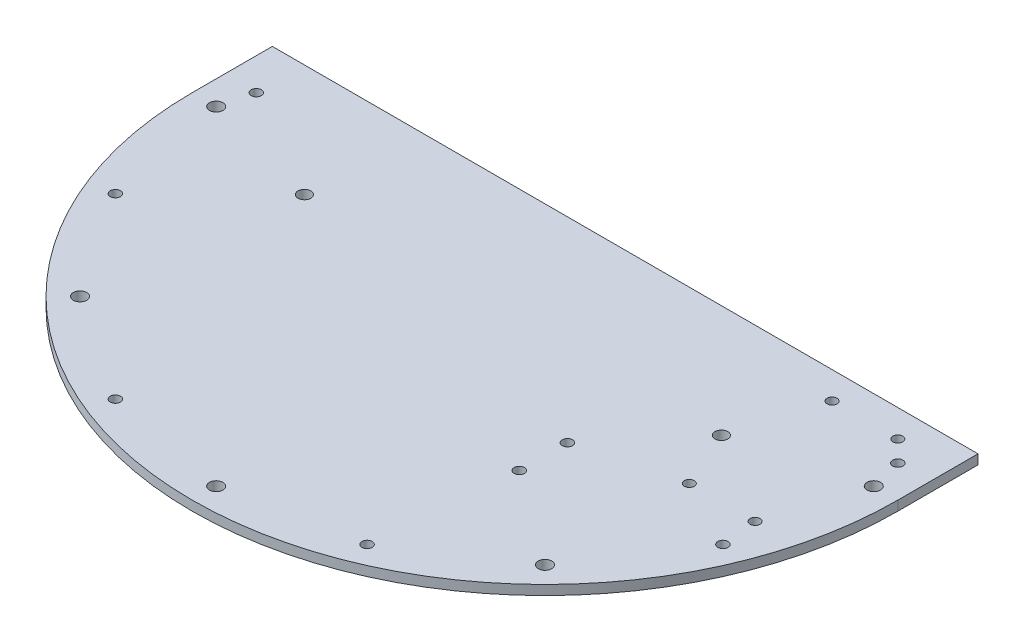
ISO-10303-21;
HEADER;
FILE_DESCRIPTION(('STEP AP214'),'2;1');
FILE_NAME('part.step','',(''),(''),'','','');
FILE_SCHEMA(('AUTOMOTIVE_DESIGN { 1 0 10303 214 1 1 1 1 }'));
ENDSEC;
DATA;
#1=APPLICATION_CONTEXT('core data for automotive mechanical design processes');
#2=APPLICATION_PROTOCOL_DEFINITION('international standard','automotive_design',2000,#1);
#3=PRODUCT_CONTEXT('',#1,'mechanical');
#4=PRODUCT('Part','Part','',(#3));
#5=PRODUCT_RELATED_PRODUCT_CATEGORY('part','',(#4));
#6=PRODUCT_DEFINITION_FORMATION('','',#4);
#7=PRODUCT_DEFINITION_CONTEXT('part definition',#1,'design');
#8=PRODUCT_DEFINITION('design','',#6,#7);
#9=PRODUCT_DEFINITION_SHAPE('','',#8);
#10=(LENGTH_UNIT() NAMED_UNIT(*) SI_UNIT(.MILLI.,.METRE.));
#11=(NAMED_UNIT(*) PLANE_ANGLE_UNIT() SI_UNIT($,.RADIAN.));
#12=(NAMED_UNIT(*) SI_UNIT($,.STERADIAN.) SOLID_ANGLE_UNIT());
#13=UNCERTAINTY_MEASURE_WITH_UNIT(LENGTH_MEASURE(1.E-05),#10,'distance_accuracy_value','');
#14=(GEOMETRIC_REPRESENTATION_CONTEXT(3) GLOBAL_UNCERTAINTY_ASSIGNED_CONTEXT((#13)) GLOBAL_UNIT_ASSIGNED_CONTEXT((#10,
#11,#12)) REPRESENTATION_CONTEXT('',''));
#15=CARTESIAN_POINT('',(0.,0.,0.));
#16=DIRECTION('',(0.,0.,1.));
#17=DIRECTION('',(1.,0.,0.));
#18=AXIS2_PLACEMENT_3D('',#15,#16,#17);
#19=CARTESIAN_POINT('',(0.,3.,0.));
#20=DIRECTION('',(0.,1.,0.));
#21=DIRECTION('',(0.,0.,1.));
#22=AXIS2_PLACEMENT_3D('',#19,#20,#21);
#23=PLANE('',#22);
#24=CARTESIAN_POINT('',(73.0000000000001,3.,-16.4999999999993));
#25=DIRECTION('',(0.,1.,0.));
#26=DIRECTION('',(0.,0.,1.));
#27=AXIS2_PLACEMENT_3D('',#24,#25,#26);
#28=CIRCLE('',#27,1.54999999999999);
#29=CARTESIAN_POINT('',(73.0000000000001,3.,-14.9499999999993));
#30=VERTEX_POINT('',#29);
#31=EDGE_CURVE('E326',#30,#30,#28,.T.);
#32=ORIENTED_EDGE('',*,*,#31,.F.);
#33=EDGE_LOOP('',(#32));
#34=FACE_BOUND('',#33,.T.);
#35=CARTESIAN_POINT('',(93.4999999999999,3.,-16.4999999999993));
#36=DIRECTION('',(0.,1.,0.));
#37=DIRECTION('',(0.,0.,1.));
#38=AXIS2_PLACEMENT_3D('',#35,#36,#37);
#39=CIRCLE('',#38,1.54999999999999);
#40=CARTESIAN_POINT('',(93.4999999999999,3.,-14.9499999999993));
#41=VERTEX_POINT('',#40);
#42=EDGE_CURVE('E320',#41,#41,#39,.T.);
#43=ORIENTED_EDGE('',*,*,#42,.F.);
#44=EDGE_LOOP('',(#43));
#45=FACE_BOUND('',#44,.T.);
#46=CARTESIAN_POINT('',(93.5,3.,28.));
#47=DIRECTION('',(0.,1.,0.));
#48=DIRECTION('',(0.,0.,1.));
#49=AXIS2_PLACEMENT_3D('',#46,#47,#48);
#50=CIRCLE('',#49,1.54999999999999);
#51=CARTESIAN_POINT('',(93.5,3.,29.55));
#52=VERTEX_POINT('',#51);
#53=EDGE_CURVE('E306',#52,#52,#50,.T.);
#54=ORIENTED_EDGE('',*,*,#53,.F.);
#55=EDGE_LOOP('',(#54));
#56=FACE_BOUND('',#55,.T.);
#57=CARTESIAN_POINT('',(43.,3.,36.));
#58=DIRECTION('',(0.,1.,0.));
#59=DIRECTION('',(0.,0.,1.));
#60=AXIS2_PLACEMENT_3D('',#57,#58,#59);
#61=CIRCLE('',#60,1.60000000000001);
#62=CARTESIAN_POINT('',(43.,3.,37.6));
#63=VERTEX_POINT('',#62);
#64=EDGE_CURVE('E134',#63,#63,#61,.T.);
#65=ORIENTED_EDGE('',*,*,#64,.F.);
#66=EDGE_LOOP('',(#65));
#67=FACE_BOUND('',#66,.T.);
#68=CARTESIAN_POINT('',(43.0000000000002,3.,51.));
#69=DIRECTION('',(0.,1.,0.));
#70=DIRECTION('',(0.,0.,1.));
#71=AXIS2_PLACEMENT_3D('',#68,#69,#70);
#72=CIRCLE('',#71,1.60000000000001);
#73=CARTESIAN_POINT('',(43.0000000000002,3.,52.6));
#74=VERTEX_POINT('',#73);
#75=EDGE_CURVE('E323',#74,#74,#72,.T.);
#76=ORIENTED_EDGE('',*,*,#75,.F.);
#77=EDGE_LOOP('',(#76));
#78=FACE_BOUND('',#77,.T.);
#79=CARTESIAN_POINT('',(73.0000000000003,3.,28.));
#80=DIRECTION('',(0.,1.,0.));
#81=DIRECTION('',(0.,0.,1.));
#82=AXIS2_PLACEMENT_3D('',#79,#80,#81);
#83=CIRCLE('',#82,1.54999999999999);
#84=CARTESIAN_POINT('',(73.0000000000003,3.,29.55));
#85=VERTEX_POINT('',#84);
#86=EDGE_CURVE('E319',#85,#85,#83,.T.);
#87=ORIENTED_EDGE('',*,*,#86,.F.);
#88=EDGE_LOOP('',(#87));
#89=FACE_BOUND('',#88,.T.);
#90=CARTESIAN_POINT('',(100.,3.,-10.));
#91=DIRECTION('',(0.,-1.,0.));
#92=DIRECTION('',(0.,0.,-1.));
#93=AXIS2_PLACEMENT_3D('',#90,#91,#92);
#94=CIRCLE('',#93,1.6);
#95=CARTESIAN_POINT('',(100.,3.,-11.6));
#96=VERTEX_POINT('',#95);
#97=EDGE_CURVE('E151',#96,#96,#94,.T.);
#98=ORIENTED_EDGE('',*,*,#97,.T.);
#99=EDGE_LOOP('',(#98));
#100=FACE_BOUND('',#99,.T.);
#101=CARTESIAN_POINT('',(94.6976520824066,3.,39.2250518174225));
#102=DIRECTION('',(0.,1.,0.));
#103=DIRECTION('',(0.,0.,1.));
#104=AXIS2_PLACEMENT_3D('',#101,#102,#103);
#105=CIRCLE('',#104,1.60000000000001);
#106=CARTESIAN_POINT('',(94.6976520824066,3.,40.8250518174225));
#107=VERTEX_POINT('',#106);
#108=EDGE_CURVE('E163',#107,#107,#105,.T.);
#109=ORIENTED_EDGE('',*,*,#108,.F.);
#110=EDGE_LOOP('',(#109));
#111=FACE_BOUND('',#110,.T.);
#112=CARTESIAN_POINT('',(72.4784450716211,3.,72.4784450716211));
#113=DIRECTION('',(0.,1.,0.));
#114=DIRECTION('',(0.,0.,1.));
#115=AXIS2_PLACEMENT_3D('',#112,#113,#114);
#116=CIRCLE('',#115,2.1);
#117=CARTESIAN_POINT('',(72.4784450716211,3.,74.5784450716211));
#118=VERTEX_POINT('',#117);
#119=EDGE_CURVE('E175',#118,#118,#116,.T.);
#120=ORIENTED_EDGE('',*,*,#119,.F.);
#121=EDGE_LOOP('',(#120));
#122=FACE_BOUND('',#121,.T.);
#123=CARTESIAN_POINT('',(102.5,3.,0.));
#124=DIRECTION('',(0.,1.,0.));
#125=DIRECTION('',(0.,0.,1.));
#126=AXIS2_PLACEMENT_3D('',#123,#124,#125);
#127=CIRCLE('',#126,2.1);
#128=CARTESIAN_POINT('',(102.5,3.,2.09999999999998));
#129=VERTEX_POINT('',#128);
#130=EDGE_CURVE('E172',#129,#129,#127,.T.);
#131=ORIENTED_EDGE('',*,*,#130,.F.);
#132=EDGE_LOOP('',(#131));
#133=FACE_BOUND('',#132,.T.);
#134=CARTESIAN_POINT('',(-102.5,3.,0.));
#135=DIRECTION('',(0.,1.,0.));
#136=DIRECTION('',(0.,0.,1.));
#137=AXIS2_PLACEMENT_3D('',#134,#135,#136);
#138=CIRCLE('',#137,2.1);
#139=CARTESIAN_POINT('',(-102.5,3.,2.10000000000002));
#140=VERTEX_POINT('',#139);
#141=EDGE_CURVE('E168',#140,#140,#138,.T.);
#142=ORIENTED_EDGE('',*,*,#141,.F.);
#143=EDGE_LOOP('',(#142));
#144=FACE_BOUND('',#143,.T.);
#145=CARTESIAN_POINT('',(-72.4784450716211,3.,72.4784450716211));
#146=DIRECTION('',(0.,1.,0.));
#147=DIRECTION('',(0.,0.,1.));
#148=AXIS2_PLACEMENT_3D('',#145,#146,#147);
#149=CIRCLE('',#148,2.1);
#150=CARTESIAN_POINT('',(-72.4784450716211,3.,74.5784450716211));
#151=VERTEX_POINT('',#150);
#152=EDGE_CURVE('E171',#151,#151,#149,.T.);
#153=ORIENTED_EDGE('',*,*,#152,.F.);
#154=EDGE_LOOP('',(#153));
#155=FACE_BOUND('',#154,.T.);
#156=CARTESIAN_POINT('',(-94.6976520824069,3.,39.2250518174218));
#157=DIRECTION('',(0.,1.,0.));
#158=DIRECTION('',(0.,0.,1.));
#159=AXIS2_PLACEMENT_3D('',#156,#157,#158);
#160=CIRCLE('',#159,1.60000000000001);
#161=CARTESIAN_POINT('',(-94.6976520824069,3.,40.8250518174218));
#162=VERTEX_POINT('',#161);
#163=EDGE_CURVE('E186',#162,#162,#160,.T.);
#164=ORIENTED_EDGE('',*,*,#163,.F.);
#165=EDGE_LOOP('',(#164));
#166=FACE_BOUND('',#165,.T.);
#167=CARTESIAN_POINT('',(0.,3.,102.5));
#168=DIRECTION('',(0.,1.,0.));
#169=DIRECTION('',(0.,0.,1.));
#170=AXIS2_PLACEMENT_3D('',#167,#168,#169);
#171=CIRCLE('',#170,2.1);
#172=CARTESIAN_POINT('',(0.,3.,104.6));
#173=VERTEX_POINT('',#172);
#174=EDGE_CURVE('E183',#173,#173,#171,.T.);
#175=ORIENTED_EDGE('',*,*,#174,.F.);
#176=EDGE_LOOP('',(#175));
#177=FACE_BOUND('',#176,.T.);
#178=CARTESIAN_POINT('',(65.,3.,10.));
#179=DIRECTION('',(0.,1.,0.));
#180=DIRECTION('',(0.,0.,-1.));
#181=AXIS2_PLACEMENT_3D('',#178,#179,#180);
#182=CIRCLE('',#181,2.);
#183=CARTESIAN_POINT('',(65.,3.,8.00000000000001));
#184=VERTEX_POINT('',#183);
#185=EDGE_CURVE('E180',#184,#184,#182,.T.);
#186=ORIENTED_EDGE('',*,*,#185,.F.);
#187=EDGE_LOOP('',(#186));
#188=FACE_BOUND('',#187,.T.);
#189=CARTESIAN_POINT('',(39.2250518174208,3.,94.6976520824073));
#190=DIRECTION('',(0.,1.,0.));
#191=DIRECTION('',(0.,0.,1.));
#192=AXIS2_PLACEMENT_3D('',#189,#190,#191);
#193=CIRCLE('',#192,1.60000000000002);
#194=CARTESIAN_POINT('',(39.2250518174208,3.,96.2976520824073));
#195=VERTEX_POINT('',#194);
#196=EDGE_CURVE('E160',#195,#195,#193,.T.);
#197=ORIENTED_EDGE('',*,*,#196,.F.);
#198=EDGE_LOOP('',(#197));
#199=FACE_BOUND('',#198,.T.);
#200=CARTESIAN_POINT('',(-39.2250518174228,3.,94.6976520824064));
#201=DIRECTION('',(0.,1.,0.));
#202=DIRECTION('',(0.,0.,1.));
#203=AXIS2_PLACEMENT_3D('',#200,#201,#202);
#204=CIRCLE('',#203,1.60000000000001);
#205=CARTESIAN_POINT('',(-39.2250518174228,3.,96.2976520824065));
#206=VERTEX_POINT('',#205);
#207=EDGE_CURVE('E164',#206,#206,#204,.T.);
#208=ORIENTED_EDGE('',*,*,#207,.F.);
#209=EDGE_LOOP('',(#208));
#210=FACE_BOUND('',#209,.T.);
#211=CARTESIAN_POINT('',(-65.,3.,10.));
#212=DIRECTION('',(0.,1.,0.));
#213=DIRECTION('',(0.,0.,1.));
#214=AXIS2_PLACEMENT_3D('',#211,#212,#213);
#215=CIRCLE('',#214,2.);
#216=CARTESIAN_POINT('',(-65.,3.,12.));
#217=VERTEX_POINT('',#216);
#218=EDGE_CURVE('E99',#217,#217,#215,.T.);
#219=ORIENTED_EDGE('',*,*,#218,.F.);
#220=EDGE_LOOP('',(#219));
#221=FACE_BOUND('',#220,.T.);
#222=DIRECTION('',(1.,0.,0.));
#223=VECTOR('',#222,1.);
#224=CARTESIAN_POINT('',(-110.,3.,-25.));
#225=LINE('',#224,#223);
#226=CARTESIAN_POINT('',(-110.,3.,-25.));
#227=VERTEX_POINT('',#226);
#228=CARTESIAN_POINT('',(110.,3.,-25.));
#229=VERTEX_POINT('',#228);
#230=EDGE_CURVE('E129',#227,#229,#225,.T.);
#231=ORIENTED_EDGE('',*,*,#230,.F.);
#232=DIRECTION('',(0.,0.,-1.));
#233=VECTOR('',#232,1.);
#234=CARTESIAN_POINT('',(-110.,3.,0.));
#235=LINE('',#234,#233);
#236=CARTESIAN_POINT('',(-110.,3.,0.));
#237=VERTEX_POINT('',#236);
#238=EDGE_CURVE('E76',#237,#227,#235,.T.);
#239=ORIENTED_EDGE('',*,*,#238,.F.);
#240=CARTESIAN_POINT('',(0.,3.,0.));
#241=DIRECTION('',(0.,1.,0.));
#242=DIRECTION('',(0.,0.,1.));
#243=AXIS2_PLACEMENT_3D('',#240,#241,#242);
#244=CIRCLE('',#243,110.);
#245=CARTESIAN_POINT('',(110.,3.,0.));
#246=VERTEX_POINT('',#245);
#247=EDGE_CURVE('E74',#237,#246,#244,.T.);
#248=ORIENTED_EDGE('',*,*,#247,.T.);
#249=DIRECTION('',(0.,0.,-1.));
#250=VECTOR('',#249,1.);
#251=CARTESIAN_POINT('',(110.,3.,0.));
#252=LINE('',#251,#250);
#253=EDGE_CURVE('E91',#246,#229,#252,.T.);
#254=ORIENTED_EDGE('',*,*,#253,.T.);
#255=EDGE_LOOP('',(#231,#239,#248,#254));
#256=FACE_BOUND('',#255,.T.);
#257=CARTESIAN_POINT('',(-100.,3.,-10.));
#258=DIRECTION('',(0.,1.,0.));
#259=DIRECTION('',(0.,0.,1.));
#260=AXIS2_PLACEMENT_3D('',#257,#258,#259);
#261=CIRCLE('',#260,1.60000000000011);
#262=CARTESIAN_POINT('',(-100.,3.,-8.39999999999989));
#263=VERTEX_POINT('',#262);
#264=EDGE_CURVE('E156',#263,#263,#261,.T.);
#265=ORIENTED_EDGE('',*,*,#264,.F.);
#266=EDGE_LOOP('',(#265));
#267=FACE_BOUND('',#266,.T.);
#268=ADVANCED_FACE('F33',(#34,#45,#56,#67,#78,#89,#100,#111,#122,#133,#144,#155,#166,#177,#188,
#199,#210,#221,#256,#267),#23,.T.);
#269=CARTESIAN_POINT('',(0.,0.,0.));
#270=DIRECTION('',(0.,1.,0.));
#271=DIRECTION('',(0.,0.,1.));
#272=AXIS2_PLACEMENT_3D('',#269,#270,#271);
#273=PLANE('',#272);
#274=CARTESIAN_POINT('',(73.0000000000001,0.,-16.4999999999993));
#275=DIRECTION('',(0.,1.,0.));
#276=DIRECTION('',(0.,0.,1.));
#277=AXIS2_PLACEMENT_3D('',#274,#275,#276);
#278=CIRCLE('',#277,1.54999999999999);
#279=CARTESIAN_POINT('',(73.0000000000001,0.,-14.9499999999993));
#280=VERTEX_POINT('',#279);
#281=EDGE_CURVE('E37',#280,#280,#278,.T.);
#282=ORIENTED_EDGE('',*,*,#281,.T.);
#283=EDGE_LOOP('',(#282));
#284=FACE_BOUND('',#283,.T.);
#285=CARTESIAN_POINT('',(93.4999999999999,0.,-16.4999999999993));
#286=DIRECTION('',(0.,1.,0.));
#287=DIRECTION('',(0.,0.,1.));
#288=AXIS2_PLACEMENT_3D('',#285,#286,#287);
#289=CIRCLE('',#288,1.54999999999999);
#290=CARTESIAN_POINT('',(93.4999999999999,0.,-14.9499999999993));
#291=VERTEX_POINT('',#290);
#292=EDGE_CURVE('E142',#291,#291,#289,.T.);
#293=ORIENTED_EDGE('',*,*,#292,.T.);
#294=EDGE_LOOP('',(#293));
#295=FACE_BOUND('',#294,.T.);
#296=CARTESIAN_POINT('',(93.5,0.,28.));
#297=DIRECTION('',(0.,1.,0.));
#298=DIRECTION('',(0.,0.,1.));
#299=AXIS2_PLACEMENT_3D('',#296,#297,#298);
#300=CIRCLE('',#299,1.54999999999999);
#301=CARTESIAN_POINT('',(93.5,0.,29.55));
#302=VERTEX_POINT('',#301);
#303=EDGE_CURVE('E140',#302,#302,#300,.T.);
#304=ORIENTED_EDGE('',*,*,#303,.T.);
#305=EDGE_LOOP('',(#304));
#306=FACE_BOUND('',#305,.T.);
#307=CARTESIAN_POINT('',(43.,0.,36.));
#308=DIRECTION('',(0.,1.,0.));
#309=DIRECTION('',(0.,0.,1.));
#310=AXIS2_PLACEMENT_3D('',#307,#308,#309);
#311=CIRCLE('',#310,1.60000000000001);
#312=CARTESIAN_POINT('',(43.,0.,37.6));
#313=VERTEX_POINT('',#312);
#314=EDGE_CURVE('E137',#313,#313,#311,.T.);
#315=ORIENTED_EDGE('',*,*,#314,.T.);
#316=EDGE_LOOP('',(#315));
#317=FACE_BOUND('',#316,.T.);
#318=CARTESIAN_POINT('',(43.0000000000002,0.,51.));
#319=DIRECTION('',(0.,1.,0.));
#320=DIRECTION('',(0.,0.,1.));
#321=AXIS2_PLACEMENT_3D('',#318,#319,#320);
#322=CIRCLE('',#321,1.60000000000001);
#323=CARTESIAN_POINT('',(43.0000000000002,0.,52.6));
#324=VERTEX_POINT('',#323);
#325=EDGE_CURVE('E133',#324,#324,#322,.T.);
#326=ORIENTED_EDGE('',*,*,#325,.T.);
#327=EDGE_LOOP('',(#326));
#328=FACE_BOUND('',#327,.T.);
#329=CARTESIAN_POINT('',(73.0000000000003,0.,28.));
#330=DIRECTION('',(0.,1.,0.));
#331=DIRECTION('',(0.,0.,1.));
#332=AXIS2_PLACEMENT_3D('',#329,#330,#331);
#333=CIRCLE('',#332,1.54999999999999);
#334=CARTESIAN_POINT('',(73.0000000000003,0.,29.55));
#335=VERTEX_POINT('',#334);
#336=EDGE_CURVE('E130',#335,#335,#333,.T.);
#337=ORIENTED_EDGE('',*,*,#336,.T.);
#338=EDGE_LOOP('',(#337));
#339=FACE_BOUND('',#338,.T.);
#340=DIRECTION('',(0.,0.,-1.));
#341=VECTOR('',#340,1.);
#342=CARTESIAN_POINT('',(-110.,0.,0.));
#343=LINE('',#342,#341);
#344=CARTESIAN_POINT('',(-110.,0.,0.));
#345=VERTEX_POINT('',#344);
#346=CARTESIAN_POINT('',(-110.,0.,-25.));
#347=VERTEX_POINT('',#346);
#348=EDGE_CURVE('E82',#345,#347,#343,.T.);
#349=ORIENTED_EDGE('',*,*,#348,.T.);
#350=DIRECTION('',(1.,0.,0.));
#351=VECTOR('',#350,1.);
#352=CARTESIAN_POINT('',(-110.,0.,-25.));
#353=LINE('',#352,#351);
#354=CARTESIAN_POINT('',(110.,0.,-25.));
#355=VERTEX_POINT('',#354);
#356=EDGE_CURVE('E193',#347,#355,#353,.T.);
#357=ORIENTED_EDGE('',*,*,#356,.T.);
#358=DIRECTION('',(0.,0.,-1.));
#359=VECTOR('',#358,1.);
#360=CARTESIAN_POINT('',(110.,0.,0.));
#361=LINE('',#360,#359);
#362=CARTESIAN_POINT('',(110.,0.,0.));
#363=VERTEX_POINT('',#362);
#364=EDGE_CURVE('E84',#363,#355,#361,.T.);
#365=ORIENTED_EDGE('',*,*,#364,.F.);
#366=CARTESIAN_POINT('',(0.,0.,0.));
#367=DIRECTION('',(0.,1.,0.));
#368=DIRECTION('',(0.,0.,1.));
#369=AXIS2_PLACEMENT_3D('',#366,#367,#368);
#370=CIRCLE('',#369,110.);
#371=EDGE_CURVE('E72',#345,#363,#370,.T.);
#372=ORIENTED_EDGE('',*,*,#371,.F.);
#373=EDGE_LOOP('',(#349,#357,#365,#372));
#374=FACE_BOUND('',#373,.T.);
#375=CARTESIAN_POINT('',(-65.,0.,10.));
#376=DIRECTION('',(0.,1.,0.));
#377=DIRECTION('',(0.,0.,1.));
#378=AXIS2_PLACEMENT_3D('',#375,#376,#377);
#379=CIRCLE('',#378,2.);
#380=CARTESIAN_POINT('',(-65.,0.,12.));
#381=VERTEX_POINT('',#380);
#382=EDGE_CURVE('E95',#381,#381,#379,.T.);
#383=ORIENTED_EDGE('',*,*,#382,.T.);
#384=EDGE_LOOP('',(#383));
#385=FACE_BOUND('',#384,.T.);
#386=CARTESIAN_POINT('',(-39.2250518174228,0.,94.6976520824064));
#387=DIRECTION('',(0.,1.,0.));
#388=DIRECTION('',(0.,0.,1.));
#389=AXIS2_PLACEMENT_3D('',#386,#387,#388);
#390=CIRCLE('',#389,1.60000000000001);
#391=CARTESIAN_POINT('',(-39.2250518174228,0.,96.2976520824065));
#392=VERTEX_POINT('',#391);
#393=EDGE_CURVE('E98',#392,#392,#390,.T.);
#394=ORIENTED_EDGE('',*,*,#393,.T.);
#395=EDGE_LOOP('',(#394));
#396=FACE_BOUND('',#395,.T.);
#397=CARTESIAN_POINT('',(39.2250518174208,0.,94.6976520824073));
#398=DIRECTION('',(0.,1.,0.));
#399=DIRECTION('',(0.,0.,1.));
#400=AXIS2_PLACEMENT_3D('',#397,#398,#399);
#401=CIRCLE('',#400,1.60000000000002);
#402=CARTESIAN_POINT('',(39.2250518174208,0.,96.2976520824073));
#403=VERTEX_POINT('',#402);
#404=EDGE_CURVE('E102',#403,#403,#401,.T.);
#405=ORIENTED_EDGE('',*,*,#404,.T.);
#406=EDGE_LOOP('',(#405));
#407=FACE_BOUND('',#406,.T.);
#408=CARTESIAN_POINT('',(65.,0.,10.));
#409=DIRECTION('',(0.,1.,0.));
#410=DIRECTION('',(0.,0.,1.));
#411=AXIS2_PLACEMENT_3D('',#408,#409,#410);
#412=CIRCLE('',#411,2.);
#413=CARTESIAN_POINT('',(65.,0.,12.));
#414=VERTEX_POINT('',#413);
#415=EDGE_CURVE('E105',#414,#414,#412,.T.);
#416=ORIENTED_EDGE('',*,*,#415,.T.);
#417=EDGE_LOOP('',(#416));
#418=FACE_BOUND('',#417,.T.);
#419=CARTESIAN_POINT('',(0.,0.,102.5));
#420=DIRECTION('',(0.,1.,0.));
#421=DIRECTION('',(0.,0.,1.));
#422=AXIS2_PLACEMENT_3D('',#419,#420,#421);
#423=CIRCLE('',#422,2.1);
#424=CARTESIAN_POINT('',(0.,0.,104.6));
#425=VERTEX_POINT('',#424);
#426=EDGE_CURVE('E108',#425,#425,#423,.T.);
#427=ORIENTED_EDGE('',*,*,#426,.T.);
#428=EDGE_LOOP('',(#427));
#429=FACE_BOUND('',#428,.T.);
#430=CARTESIAN_POINT('',(-94.6976520824069,0.,39.2250518174218));
#431=DIRECTION('',(0.,1.,0.));
#432=DIRECTION('',(0.,0.,1.));
#433=AXIS2_PLACEMENT_3D('',#430,#431,#432);
#434=CIRCLE('',#433,1.60000000000001);
#435=CARTESIAN_POINT('',(-94.6976520824069,0.,40.8250518174218));
#436=VERTEX_POINT('',#435);
#437=EDGE_CURVE('E111',#436,#436,#434,.T.);
#438=ORIENTED_EDGE('',*,*,#437,.T.);
#439=EDGE_LOOP('',(#438));
#440=FACE_BOUND('',#439,.T.);
#441=CARTESIAN_POINT('',(-72.4784450716211,0.,72.4784450716211));
#442=DIRECTION('',(0.,1.,0.));
#443=DIRECTION('',(0.,0.,1.));
#444=AXIS2_PLACEMENT_3D('',#441,#442,#443);
#445=CIRCLE('',#444,2.1);
#446=CARTESIAN_POINT('',(-72.4784450716211,0.,74.5784450716211));
#447=VERTEX_POINT('',#446);
#448=EDGE_CURVE('E114',#447,#447,#445,.T.);
#449=ORIENTED_EDGE('',*,*,#448,.T.);
#450=EDGE_LOOP('',(#449));
#451=FACE_BOUND('',#450,.T.);
#452=CARTESIAN_POINT('',(-102.5,0.,0.));
#453=DIRECTION('',(0.,1.,0.));
#454=DIRECTION('',(0.,0.,1.));
#455=AXIS2_PLACEMENT_3D('',#452,#453,#454);
#456=CIRCLE('',#455,2.1);
#457=CARTESIAN_POINT('',(-102.5,0.,2.10000000000002));
#458=VERTEX_POINT('',#457);
#459=EDGE_CURVE('E117',#458,#458,#456,.T.);
#460=ORIENTED_EDGE('',*,*,#459,.T.);
#461=EDGE_LOOP('',(#460));
#462=FACE_BOUND('',#461,.T.);
#463=CARTESIAN_POINT('',(102.5,0.,0.));
#464=DIRECTION('',(0.,1.,0.));
#465=DIRECTION('',(0.,0.,1.));
#466=AXIS2_PLACEMENT_3D('',#463,#464,#465);
#467=CIRCLE('',#466,2.1);
#468=CARTESIAN_POINT('',(102.5,0.,2.09999999999998));
#469=VERTEX_POINT('',#468);
#470=EDGE_CURVE('E120',#469,#469,#467,.T.);
#471=ORIENTED_EDGE('',*,*,#470,.T.);
#472=EDGE_LOOP('',(#471));
#473=FACE_BOUND('',#472,.T.);
#474=CARTESIAN_POINT('',(72.4784450716211,0.,72.4784450716211));
#475=DIRECTION('',(0.,1.,0.));
#476=DIRECTION('',(0.,0.,1.));
#477=AXIS2_PLACEMENT_3D('',#474,#475,#476);
#478=CIRCLE('',#477,2.1);
#479=CARTESIAN_POINT('',(72.4784450716211,0.,74.5784450716211));
#480=VERTEX_POINT('',#479);
#481=EDGE_CURVE('E123',#480,#480,#478,.T.);
#482=ORIENTED_EDGE('',*,*,#481,.T.);
#483=EDGE_LOOP('',(#482));
#484=FACE_BOUND('',#483,.T.);
#485=CARTESIAN_POINT('',(94.6976520824066,0.,39.2250518174225));
#486=DIRECTION('',(0.,1.,0.));
#487=DIRECTION('',(0.,0.,1.));
#488=AXIS2_PLACEMENT_3D('',#485,#486,#487);
#489=CIRCLE('',#488,1.60000000000001);
#490=CARTESIAN_POINT('',(94.6976520824066,0.,40.8250518174225));
#491=VERTEX_POINT('',#490);
#492=EDGE_CURVE('E126',#491,#491,#489,.T.);
#493=ORIENTED_EDGE('',*,*,#492,.T.);
#494=EDGE_LOOP('',(#493));
#495=FACE_BOUND('',#494,.T.);
#496=CARTESIAN_POINT('',(100.,0.,-10.));
#497=DIRECTION('',(0.,-1.,0.));
#498=DIRECTION('',(0.,0.,-1.));
#499=AXIS2_PLACEMENT_3D('',#496,#497,#498);
#500=CIRCLE('',#499,1.6);
#501=CARTESIAN_POINT('',(100.,0.,-11.6));
#502=VERTEX_POINT('',#501);
#503=EDGE_CURVE('E147',#502,#502,#500,.T.);
#504=ORIENTED_EDGE('',*,*,#503,.F.);
#505=EDGE_LOOP('',(#504));
#506=FACE_BOUND('',#505,.T.);
#507=CARTESIAN_POINT('',(-100.,0.,-10.));
#508=DIRECTION('',(0.,1.,0.));
#509=DIRECTION('',(0.,0.,1.));
#510=AXIS2_PLACEMENT_3D('',#507,#508,#509);
#511=CIRCLE('',#510,1.60000000000011);
#512=CARTESIAN_POINT('',(-100.,0.,-8.39999999999989));
#513=VERTEX_POINT('',#512);
#514=EDGE_CURVE('E167',#513,#513,#511,.T.);
#515=ORIENTED_EDGE('',*,*,#514,.T.);
#516=EDGE_LOOP('',(#515));
#517=FACE_BOUND('',#516,.T.);
#518=ADVANCED_FACE('F80',(#284,#295,#306,#317,#328,#339,#374,#385,#396,#407,#418,#429,#440,#451,
#462,#473,#484,#495,#506,#517),#273,.F.);
#519=CARTESIAN_POINT('',(0.,3.,0.));
#520=DIRECTION('',(0.,-1.,0.));
#521=DIRECTION('',(0.,0.,-1.));
#522=AXIS2_PLACEMENT_3D('',#519,#520,#521);
#523=CYLINDRICAL_SURFACE('',#522,110.);
#524=ORIENTED_EDGE('',*,*,#371,.T.);
#525=DIRECTION('',(0.,-1.,0.));
#526=VECTOR('',#525,1.);
#527=CARTESIAN_POINT('',(110.,3.,0.));
#528=LINE('',#527,#526);
#529=EDGE_CURVE('E11',#246,#363,#528,.T.);
#530=ORIENTED_EDGE('',*,*,#529,.F.);
#531=ORIENTED_EDGE('',*,*,#247,.F.);
#532=DIRECTION('',(0.,-1.,0.));
#533=VECTOR('',#532,1.);
#534=CARTESIAN_POINT('',(-110.,3.,0.));
#535=LINE('',#534,#533);
#536=EDGE_CURVE('E42',#237,#345,#535,.T.);
#537=ORIENTED_EDGE('',*,*,#536,.T.);
#538=EDGE_LOOP('',(#524,#530,#531,#537));
#539=FACE_BOUND('',#538,.T.);
#540=ADVANCED_FACE('F35',(#539),#523,.T.);
#541=CARTESIAN_POINT('',(110.,3.,0.));
#542=DIRECTION('',(-1.,0.,0.));
#543=DIRECTION('',(0.,0.,1.));
#544=AXIS2_PLACEMENT_3D('',#541,#542,#543);
#545=PLANE('',#544);
#546=ORIENTED_EDGE('',*,*,#364,.T.);
#547=DIRECTION('',(0.,1.,0.));
#548=VECTOR('',#547,1.);
#549=CARTESIAN_POINT('',(110.,0.,-25.));
#550=LINE('',#549,#548);
#551=EDGE_CURVE('E50',#355,#229,#550,.T.);
#552=ORIENTED_EDGE('',*,*,#551,.T.);
#553=ORIENTED_EDGE('',*,*,#253,.F.);
#554=ORIENTED_EDGE('',*,*,#529,.T.);
#555=EDGE_LOOP('',(#546,#552,#553,#554));
#556=FACE_BOUND('',#555,.T.);
#557=ADVANCED_FACE('F208',(#556),#545,.F.);
#558=CARTESIAN_POINT('',(-110.,3.,0.));
#559=DIRECTION('',(-1.,0.,0.));
#560=DIRECTION('',(0.,0.,1.));
#561=AXIS2_PLACEMENT_3D('',#558,#559,#560);
#562=PLANE('',#561);
#563=DIRECTION('',(0.,1.,0.));
#564=VECTOR('',#563,1.);
#565=CARTESIAN_POINT('',(-110.,0.,-25.));
#566=LINE('',#565,#564);
#567=EDGE_CURVE('E89',#347,#227,#566,.T.);
#568=ORIENTED_EDGE('',*,*,#567,.F.);
#569=ORIENTED_EDGE('',*,*,#348,.F.);
#570=ORIENTED_EDGE('',*,*,#536,.F.);
#571=ORIENTED_EDGE('',*,*,#238,.T.);
#572=EDGE_LOOP('',(#568,#569,#570,#571));
#573=FACE_BOUND('',#572,.T.);
#574=ADVANCED_FACE('F87',(#573),#562,.T.);
#575=CARTESIAN_POINT('',(-110.,0.,-25.));
#576=DIRECTION('',(0.,0.,1.));
#577=DIRECTION('',(1.,0.,0.));
#578=AXIS2_PLACEMENT_3D('',#575,#576,#577);
#579=PLANE('',#578);
#580=ORIENTED_EDGE('',*,*,#230,.T.);
#581=ORIENTED_EDGE('',*,*,#551,.F.);
#582=ORIENTED_EDGE('',*,*,#356,.F.);
#583=ORIENTED_EDGE('',*,*,#567,.T.);
#584=EDGE_LOOP('',(#580,#581,#582,#583));
#585=FACE_BOUND('',#584,.T.);
#586=ADVANCED_FACE('F206',(#585),#579,.F.);
#587=CARTESIAN_POINT('',(-65.,-7.,10.));
#588=DIRECTION('',(0.,1.,0.));
#589=DIRECTION('',(0.,0.,1.));
#590=AXIS2_PLACEMENT_3D('',#587,#588,#589);
#591=CYLINDRICAL_SURFACE('',#590,2.);
#592=ORIENTED_EDGE('',*,*,#218,.T.);
#593=EDGE_LOOP('',(#592));
#594=FACE_BOUND('',#593,.T.);
#595=ORIENTED_EDGE('',*,*,#382,.F.);
#596=EDGE_LOOP('',(#595));
#597=FACE_BOUND('',#596,.T.);
#598=ADVANCED_FACE('F227',(#594,#597),#591,.F.);
#599=CARTESIAN_POINT('',(-39.2250518174228,-7.,94.6976520824064));
#600=DIRECTION('',(0.,1.,0.));
#601=DIRECTION('',(0.,0.,1.));
#602=AXIS2_PLACEMENT_3D('',#599,#600,#601);
#603=CYLINDRICAL_SURFACE('',#602,1.60000000000001);
#604=ORIENTED_EDGE('',*,*,#207,.T.);
#605=EDGE_LOOP('',(#604));
#606=FACE_BOUND('',#605,.T.);
#607=ORIENTED_EDGE('',*,*,#393,.F.);
#608=EDGE_LOOP('',(#607));
#609=FACE_BOUND('',#608,.T.);
#610=ADVANCED_FACE('F230',(#606,#609),#603,.F.);
#611=CARTESIAN_POINT('',(39.2250518174208,-7.,94.6976520824073));
#612=DIRECTION('',(0.,1.,0.));
#613=DIRECTION('',(0.,0.,1.));
#614=AXIS2_PLACEMENT_3D('',#611,#612,#613);
#615=CYLINDRICAL_SURFACE('',#614,1.60000000000002);
#616=ORIENTED_EDGE('',*,*,#196,.T.);
#617=EDGE_LOOP('',(#616));
#618=FACE_BOUND('',#617,.T.);
#619=ORIENTED_EDGE('',*,*,#404,.F.);
#620=EDGE_LOOP('',(#619));
#621=FACE_BOUND('',#620,.T.);
#622=ADVANCED_FACE('F248',(#618,#621),#615,.F.);
#623=CARTESIAN_POINT('',(65.,-7.,10.));
#624=DIRECTION('',(0.,1.,0.));
#625=DIRECTION('',(0.,0.,1.));
#626=AXIS2_PLACEMENT_3D('',#623,#624,#625);
#627=CYLINDRICAL_SURFACE('',#626,2.);
#628=ORIENTED_EDGE('',*,*,#185,.T.);
#629=EDGE_LOOP('',(#628));
#630=FACE_BOUND('',#629,.T.);
#631=ORIENTED_EDGE('',*,*,#415,.F.);
#632=EDGE_LOOP('',(#631));
#633=FACE_BOUND('',#632,.T.);
#634=ADVANCED_FACE('F244',(#630,#633),#627,.F.);
#635=CARTESIAN_POINT('',(0.,-7.,102.5));
#636=DIRECTION('',(0.,1.,0.));
#637=DIRECTION('',(0.,0.,1.));
#638=AXIS2_PLACEMENT_3D('',#635,#636,#637);
#639=CYLINDRICAL_SURFACE('',#638,2.1);
#640=ORIENTED_EDGE('',*,*,#174,.T.);
#641=EDGE_LOOP('',(#640));
#642=FACE_BOUND('',#641,.T.);
#643=ORIENTED_EDGE('',*,*,#426,.F.);
#644=EDGE_LOOP('',(#643));
#645=FACE_BOUND('',#644,.T.);
#646=ADVANCED_FACE('F240',(#642,#645),#639,.F.);
#647=CARTESIAN_POINT('',(-94.6976520824069,-7.,39.2250518174218));
#648=DIRECTION('',(0.,1.,0.));
#649=DIRECTION('',(0.,0.,1.));
#650=AXIS2_PLACEMENT_3D('',#647,#648,#649);
#651=CYLINDRICAL_SURFACE('',#650,1.60000000000001);
#652=ORIENTED_EDGE('',*,*,#163,.T.);
#653=EDGE_LOOP('',(#652));
#654=FACE_BOUND('',#653,.T.);
#655=ORIENTED_EDGE('',*,*,#437,.F.);
#656=EDGE_LOOP('',(#655));
#657=FACE_BOUND('',#656,.T.);
#658=ADVANCED_FACE('F236',(#654,#657),#651,.F.);
#659=CARTESIAN_POINT('',(-72.4784450716211,-7.,72.4784450716211));
#660=DIRECTION('',(0.,1.,0.));
#661=DIRECTION('',(0.,0.,1.));
#662=AXIS2_PLACEMENT_3D('',#659,#660,#661);
#663=CYLINDRICAL_SURFACE('',#662,2.1);
#664=ORIENTED_EDGE('',*,*,#152,.T.);
#665=EDGE_LOOP('',(#664));
#666=FACE_BOUND('',#665,.T.);
#667=ORIENTED_EDGE('',*,*,#448,.F.);
#668=EDGE_LOOP('',(#667));
#669=FACE_BOUND('',#668,.T.);
#670=ADVANCED_FACE('F232',(#666,#669),#663,.F.);
#671=CARTESIAN_POINT('',(-102.5,-7.,0.));
#672=DIRECTION('',(0.,1.,0.));
#673=DIRECTION('',(0.,0.,1.));
#674=AXIS2_PLACEMENT_3D('',#671,#672,#673);
#675=CYLINDRICAL_SURFACE('',#674,2.1);
#676=ORIENTED_EDGE('',*,*,#141,.T.);
#677=EDGE_LOOP('',(#676));
#678=FACE_BOUND('',#677,.T.);
#679=ORIENTED_EDGE('',*,*,#459,.F.);
#680=EDGE_LOOP('',(#679));
#681=FACE_BOUND('',#680,.T.);
#682=ADVANCED_FACE('F235',(#678,#681),#675,.F.);
#683=CARTESIAN_POINT('',(102.5,-7.,0.));
#684=DIRECTION('',(0.,1.,0.));
#685=DIRECTION('',(0.,0.,1.));
#686=AXIS2_PLACEMENT_3D('',#683,#684,#685);
#687=CYLINDRICAL_SURFACE('',#686,2.1);
#688=ORIENTED_EDGE('',*,*,#130,.T.);
#689=EDGE_LOOP('',(#688));
#690=FACE_BOUND('',#689,.T.);
#691=ORIENTED_EDGE('',*,*,#470,.F.);
#692=EDGE_LOOP('',(#691));
#693=FACE_BOUND('',#692,.T.);
#694=ADVANCED_FACE('F258',(#690,#693),#687,.F.);
#695=CARTESIAN_POINT('',(72.4784450716211,-7.,72.4784450716211));
#696=DIRECTION('',(0.,1.,0.));
#697=DIRECTION('',(0.,0.,1.));
#698=AXIS2_PLACEMENT_3D('',#695,#696,#697);
#699=CYLINDRICAL_SURFACE('',#698,2.1);
#700=ORIENTED_EDGE('',*,*,#119,.T.);
#701=EDGE_LOOP('',(#700));
#702=FACE_BOUND('',#701,.T.);
#703=ORIENTED_EDGE('',*,*,#481,.F.);
#704=EDGE_LOOP('',(#703));
#705=FACE_BOUND('',#704,.T.);
#706=ADVANCED_FACE('F254',(#702,#705),#699,.F.);
#707=CARTESIAN_POINT('',(94.6976520824066,-7.,39.2250518174225));
#708=DIRECTION('',(0.,1.,0.));
#709=DIRECTION('',(0.,0.,1.));
#710=AXIS2_PLACEMENT_3D('',#707,#708,#709);
#711=CYLINDRICAL_SURFACE('',#710,1.60000000000001);
#712=ORIENTED_EDGE('',*,*,#108,.T.);
#713=EDGE_LOOP('',(#712));
#714=FACE_BOUND('',#713,.T.);
#715=ORIENTED_EDGE('',*,*,#492,.F.);
#716=EDGE_LOOP('',(#715));
#717=FACE_BOUND('',#716,.T.);
#718=ADVANCED_FACE('F250',(#714,#717),#711,.F.);
#719=CARTESIAN_POINT('',(100.,0.,-10.));
#720=DIRECTION('',(0.,1.,0.));
#721=DIRECTION('',(0.,0.,1.));
#722=AXIS2_PLACEMENT_3D('',#719,#720,#721);
#723=CYLINDRICAL_SURFACE('',#722,1.6);
#724=ORIENTED_EDGE('',*,*,#503,.T.);
#725=EDGE_LOOP('',(#724));
#726=FACE_BOUND('',#725,.T.);
#727=ORIENTED_EDGE('',*,*,#97,.F.);
#728=EDGE_LOOP('',(#727));
#729=FACE_BOUND('',#728,.T.);
#730=ADVANCED_FACE('F253',(#726,#729),#723,.F.);
#731=CARTESIAN_POINT('',(-100.,0.,-10.));
#732=DIRECTION('',(0.,1.,0.));
#733=DIRECTION('',(0.,0.,1.));
#734=AXIS2_PLACEMENT_3D('',#731,#732,#733);
#735=CYLINDRICAL_SURFACE('',#734,1.60000000000011);
#736=ORIENTED_EDGE('',*,*,#514,.F.);
#737=EDGE_LOOP('',(#736));
#738=FACE_BOUND('',#737,.T.);
#739=ORIENTED_EDGE('',*,*,#264,.T.);
#740=EDGE_LOOP('',(#739));
#741=FACE_BOUND('',#740,.T.);
#742=ADVANCED_FACE('F274',(#738,#741),#735,.F.);
#743=CARTESIAN_POINT('',(73.0000000000003,-7.,28.));
#744=DIRECTION('',(0.,1.,0.));
#745=DIRECTION('',(0.,0.,1.));
#746=AXIS2_PLACEMENT_3D('',#743,#744,#745);
#747=CYLINDRICAL_SURFACE('',#746,1.54999999999999);
#748=ORIENTED_EDGE('',*,*,#86,.T.);
#749=EDGE_LOOP('',(#748));
#750=FACE_BOUND('',#749,.T.);
#751=ORIENTED_EDGE('',*,*,#336,.F.);
#752=EDGE_LOOP('',(#751));
#753=FACE_BOUND('',#752,.T.);
#754=ADVANCED_FACE('F277',(#750,#753),#747,.F.);
#755=CARTESIAN_POINT('',(43.0000000000002,-7.,51.));
#756=DIRECTION('',(0.,1.,0.));
#757=DIRECTION('',(0.,0.,1.));
#758=AXIS2_PLACEMENT_3D('',#755,#756,#757);
#759=CYLINDRICAL_SURFACE('',#758,1.60000000000001);
#760=ORIENTED_EDGE('',*,*,#75,.T.);
#761=EDGE_LOOP('',(#760));
#762=FACE_BOUND('',#761,.T.);
#763=ORIENTED_EDGE('',*,*,#325,.F.);
#764=EDGE_LOOP('',(#763));
#765=FACE_BOUND('',#764,.T.);
#766=ADVANCED_FACE('F283',(#762,#765),#759,.F.);
#767=CARTESIAN_POINT('',(43.,-7.,36.));
#768=DIRECTION('',(0.,1.,0.));
#769=DIRECTION('',(0.,0.,1.));
#770=AXIS2_PLACEMENT_3D('',#767,#768,#769);
#771=CYLINDRICAL_SURFACE('',#770,1.60000000000001);
#772=ORIENTED_EDGE('',*,*,#64,.T.);
#773=EDGE_LOOP('',(#772));
#774=FACE_BOUND('',#773,.T.);
#775=ORIENTED_EDGE('',*,*,#314,.F.);
#776=EDGE_LOOP('',(#775));
#777=FACE_BOUND('',#776,.T.);
#778=ADVANCED_FACE('F279',(#774,#777),#771,.F.);
#779=CARTESIAN_POINT('',(93.5,-7.,28.));
#780=DIRECTION('',(0.,1.,0.));
#781=DIRECTION('',(0.,0.,1.));
#782=AXIS2_PLACEMENT_3D('',#779,#780,#781);
#783=CYLINDRICAL_SURFACE('',#782,1.54999999999999);
#784=ORIENTED_EDGE('',*,*,#53,.T.);
#785=EDGE_LOOP('',(#784));
#786=FACE_BOUND('',#785,.T.);
#787=ORIENTED_EDGE('',*,*,#303,.F.);
#788=EDGE_LOOP('',(#787));
#789=FACE_BOUND('',#788,.T.);
#790=ADVANCED_FACE('F282',(#786,#789),#783,.F.);
#791=CARTESIAN_POINT('',(93.4999999999999,-7.,-16.4999999999993));
#792=DIRECTION('',(0.,1.,0.));
#793=DIRECTION('',(0.,0.,1.));
#794=AXIS2_PLACEMENT_3D('',#791,#792,#793);
#795=CYLINDRICAL_SURFACE('',#794,1.54999999999999);
#796=ORIENTED_EDGE('',*,*,#42,.T.);
#797=EDGE_LOOP('',(#796));
#798=FACE_BOUND('',#797,.T.);
#799=ORIENTED_EDGE('',*,*,#292,.F.);
#800=EDGE_LOOP('',(#799));
#801=FACE_BOUND('',#800,.T.);
#802=ADVANCED_FACE('F294',(#798,#801),#795,.F.);
#803=CARTESIAN_POINT('',(73.0000000000001,-7.,-16.4999999999993));
#804=DIRECTION('',(0.,1.,0.));
#805=DIRECTION('',(0.,0.,1.));
#806=AXIS2_PLACEMENT_3D('',#803,#804,#805);
#807=CYLINDRICAL_SURFACE('',#806,1.54999999999999);
#808=ORIENTED_EDGE('',*,*,#31,.T.);
#809=EDGE_LOOP('',(#808));
#810=FACE_BOUND('',#809,.T.);
#811=ORIENTED_EDGE('',*,*,#281,.F.);
#812=EDGE_LOOP('',(#811));
#813=FACE_BOUND('',#812,.T.);
#814=ADVANCED_FACE('F291',(#810,#813),#807,.F.);
#815=CLOSED_SHELL('',(#268,#518,#540,#557,#574,#586,#598,#610,#622,#634,#646,#658,#670,#682,
#694,#706,#718,#730,#742,#754,#766,#778,#790,#802,#814));
#816=MANIFOLD_SOLID_BREP('B2',#815);
#817=ADVANCED_BREP_SHAPE_REPRESENTATION('',(#18,#816),#14);
#818=SHAPE_DEFINITION_REPRESENTATION(#9,#817);
ENDSEC;
END-ISO-10303-21;
